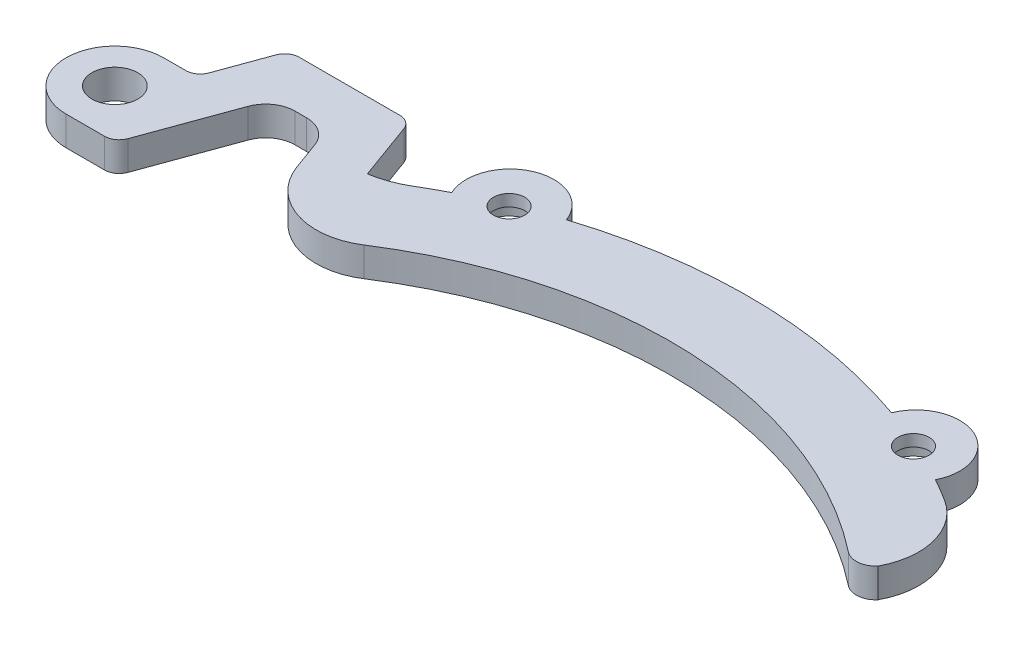
ISO-10303-21;
HEADER;
FILE_DESCRIPTION(('STEP AP214'),'2;1');
FILE_NAME('part.step','',(''),(''),'','','');
FILE_SCHEMA(('AUTOMOTIVE_DESIGN { 1 0 10303 214 1 1 1 1 }'));
ENDSEC;
DATA;
#1=APPLICATION_CONTEXT('core data for automotive mechanical design processes');
#2=APPLICATION_PROTOCOL_DEFINITION('international standard','automotive_design',2000,#1);
#3=PRODUCT_CONTEXT('',#1,'mechanical');
#4=PRODUCT('Part','Part','',(#3));
#5=PRODUCT_RELATED_PRODUCT_CATEGORY('part','',(#4));
#6=PRODUCT_DEFINITION_FORMATION('','',#4);
#7=PRODUCT_DEFINITION_CONTEXT('part definition',#1,'design');
#8=PRODUCT_DEFINITION('design','',#6,#7);
#9=PRODUCT_DEFINITION_SHAPE('','',#8);
#10=(LENGTH_UNIT() NAMED_UNIT(*) SI_UNIT(.MILLI.,.METRE.));
#11=(NAMED_UNIT(*) PLANE_ANGLE_UNIT() SI_UNIT($,.RADIAN.));
#12=(NAMED_UNIT(*) SI_UNIT($,.STERADIAN.) SOLID_ANGLE_UNIT());
#13=UNCERTAINTY_MEASURE_WITH_UNIT(LENGTH_MEASURE(1.E-05),#10,'distance_accuracy_value','');
#14=(GEOMETRIC_REPRESENTATION_CONTEXT(3) GLOBAL_UNCERTAINTY_ASSIGNED_CONTEXT((#13)) GLOBAL_UNIT_ASSIGNED_CONTEXT((#10,
#11,#12)) REPRESENTATION_CONTEXT('',''));
#15=CARTESIAN_POINT('',(0.,0.,0.));
#16=DIRECTION('',(0.,0.,1.));
#17=DIRECTION('',(1.,0.,0.));
#18=AXIS2_PLACEMENT_3D('',#15,#16,#17);
#19=CARTESIAN_POINT('',(-18.1544486033679,-8.49803041918904,6.6076789111415));
#20=DIRECTION('',(-0.939692620785909,0.,0.342020143325667));
#21=DIRECTION('',(0.342020143325667,0.,0.939692620785909));
#22=AXIS2_PLACEMENT_3D('',#19,#20,#21);
#23=PLANE('',#22);
#24=DIRECTION('',(0.342020143325667,0.,0.939692620785909));
#25=VECTOR('',#24,1.);
#26=CARTESIAN_POINT('',(-18.1544486033679,-8.49803041918904,6.6076789111415));
#27=LINE('',#26,#25);
#28=CARTESIAN_POINT('',(-17.0906558751119,-8.49803041918904,9.53042541100485));
#29=VERTEX_POINT('',#28);
#30=CARTESIAN_POINT('',(-14.9509114216332,-8.49803041918904,15.4093249803407));
#31=VERTEX_POINT('',#30);
#32=EDGE_CURVE('E209',#29,#31,#27,.T.);
#33=ORIENTED_EDGE('',*,*,#32,.F.);
#34=DIRECTION('',(0.,1.,0.));
#35=VECTOR('',#34,1.);
#36=CARTESIAN_POINT('',(-17.0906558751119,-8.49803041918904,9.53042541100485));
#37=LINE('',#36,#35);
#38=CARTESIAN_POINT('',(-17.0906558751119,-5.49803041918904,9.53042541100485));
#39=VERTEX_POINT('',#38);
#40=EDGE_CURVE('E259',#29,#39,#37,.T.);
#41=ORIENTED_EDGE('',*,*,#40,.T.);
#42=DIRECTION('',(0.342020143325667,0.,0.939692620785909));
#43=VECTOR('',#42,1.);
#44=CARTESIAN_POINT('',(-18.1544486033679,-5.49803041918904,6.6076789111415));
#45=LINE('',#44,#43);
#46=CARTESIAN_POINT('',(-14.9509114216332,-5.49803041918904,15.4093249803407));
#47=VERTEX_POINT('',#46);
#48=EDGE_CURVE('E236',#39,#47,#45,.T.);
#49=ORIENTED_EDGE('',*,*,#48,.T.);
#50=DIRECTION('',(0.,1.,0.));
#51=VECTOR('',#50,1.);
#52=CARTESIAN_POINT('',(-14.9509114216332,-8.49803041918904,15.4093249803407));
#53=LINE('',#52,#51);
#54=EDGE_CURVE('E228',#31,#47,#53,.T.);
#55=ORIENTED_EDGE('',*,*,#54,.F.);
#56=EDGE_LOOP('',(#33,#41,#49,#55));
#57=FACE_BOUND('',#56,.T.);
#58=ADVANCED_FACE('F43',(#57),#23,.F.);
#59=CARTESIAN_POINT('',(-16.5832783788304,-8.49803041918904,5.54345562599335));
#60=DIRECTION('',(0.,1.,0.));
#61=DIRECTION('',(0.,0.,1.));
#62=AXIS2_PLACEMENT_3D('',#59,#60,#61);
#63=CYLINDRICAL_SURFACE('',#62,10.);
#64=CARTESIAN_POINT('',(-16.5832783788304,-5.49803041918904,5.54345562599335));
#65=DIRECTION('',(0.,-1.,0.));
#66=DIRECTION('',(0.,0.,-1.));
#67=AXIS2_PLACEMENT_3D('',#64,#65,#66);
#68=CIRCLE('',#67,10.);
#69=CARTESIAN_POINT('',(-11.4856920139622,-5.49803041918904,14.146630229168));
#70=VERTEX_POINT('',#69);
#71=EDGE_CURVE('E381',#47,#70,#68,.F.);
#72=ORIENTED_EDGE('',*,*,#71,.T.);
#73=DIRECTION('',(0.,1.,0.));
#74=VECTOR('',#73,1.);
#75=CARTESIAN_POINT('',(-11.4856920139622,-8.49803041918904,14.146630229168));
#76=LINE('',#75,#74);
#77=CARTESIAN_POINT('',(-11.4856920139622,-8.49803041918904,14.146630229168));
#78=VERTEX_POINT('',#77);
#79=EDGE_CURVE('E230',#78,#70,#76,.T.);
#80=ORIENTED_EDGE('',*,*,#79,.F.);
#81=CARTESIAN_POINT('',(-16.5832783788304,-8.49803041918904,5.54345562599335));
#82=DIRECTION('',(0.,-1.,0.));
#83=DIRECTION('',(0.,0.,-1.));
#84=AXIS2_PLACEMENT_3D('',#81,#82,#83);
#85=CIRCLE('',#84,10.);
#86=EDGE_CURVE('E214',#31,#78,#85,.F.);
#87=ORIENTED_EDGE('',*,*,#86,.F.);
#88=ORIENTED_EDGE('',*,*,#54,.T.);
#89=EDGE_LOOP('',(#72,#80,#87,#88));
#90=FACE_BOUND('',#89,.T.);
#91=ADVANCED_FACE('F227',(#90),#63,.F.);
#92=CARTESIAN_POINT('',(15.5315157198393,-8.49803041918904,59.7434556259938));
#93=DIRECTION('',(0.,1.,0.));
#94=DIRECTION('',(0.,0.,1.));
#95=AXIS2_PLACEMENT_3D('',#92,#93,#94);
#96=CYLINDRICAL_SURFACE('',#95,53.);
#97=CARTESIAN_POINT('',(15.5315157198393,-5.49803041918904,59.7434556259938));
#98=DIRECTION('',(0.,-1.,0.));
#99=DIRECTION('',(0.,0.,-1.));
#100=AXIS2_PLACEMENT_3D('',#97,#98,#99);
#101=CIRCLE('',#100,53.);
#102=CARTESIAN_POINT('',(-8.96711599722418,-5.49803041918904,12.7454020068099));
#103=VERTEX_POINT('',#102);
#104=EDGE_CURVE('E385',#70,#103,#101,.T.);
#105=ORIENTED_EDGE('',*,*,#104,.T.);
#106=DIRECTION('',(0.,1.,0.));
#107=VECTOR('',#106,1.);
#108=CARTESIAN_POINT('',(-8.96711599722418,-8.49803041918904,12.7454020068099));
#109=LINE('',#108,#107);
#110=CARTESIAN_POINT('',(-8.96711599722418,-8.49803041918904,12.7454020068099));
#111=VERTEX_POINT('',#110);
#112=EDGE_CURVE('E246',#111,#103,#109,.T.);
#113=ORIENTED_EDGE('',*,*,#112,.F.);
#114=CARTESIAN_POINT('',(15.5315157198393,-8.49803041918904,59.7434556259938));
#115=DIRECTION('',(0.,-1.,0.));
#116=DIRECTION('',(0.,0.,-1.));
#117=AXIS2_PLACEMENT_3D('',#114,#115,#116);
#118=CIRCLE('',#117,53.);
#119=EDGE_CURVE('E233',#78,#111,#118,.T.);
#120=ORIENTED_EDGE('',*,*,#119,.F.);
#121=ORIENTED_EDGE('',*,*,#79,.T.);
#122=EDGE_LOOP('',(#105,#113,#120,#121));
#123=FACE_BOUND('',#122,.T.);
#124=ADVANCED_FACE('F551',(#123),#96,.T.);
#125=CARTESIAN_POINT('',(-4.89200771055495,-8.49803041918904,10.8366085523157));
#126=DIRECTION('',(0.,1.,0.));
#127=DIRECTION('',(0.,0.,1.));
#128=AXIS2_PLACEMENT_3D('',#125,#126,#127);
#129=CYLINDRICAL_SURFACE('',#128,4.5);
#130=CARTESIAN_POINT('',(-4.89200771055495,-5.49803041918904,10.8366085523157));
#131=DIRECTION('',(0.,-1.,0.));
#132=DIRECTION('',(0.,0.,-1.));
#133=AXIS2_PLACEMENT_3D('',#130,#131,#132);
#134=CIRCLE('',#133,4.5);
#135=CARTESIAN_POINT('',(-0.669666832406358,-5.49803041918904,9.28038314810351));
#136=VERTEX_POINT('',#135);
#137=EDGE_CURVE('E388',#103,#136,#134,.T.);
#138=ORIENTED_EDGE('',*,*,#137,.T.);
#139=DIRECTION('',(0.,1.,0.));
#140=VECTOR('',#139,1.);
#141=CARTESIAN_POINT('',(-0.669666832406358,-8.49803041918904,9.28038314810351));
#142=LINE('',#141,#140);
#143=CARTESIAN_POINT('',(-0.669666832406358,-8.49803041918904,9.28038314810351));
#144=VERTEX_POINT('',#143);
#145=EDGE_CURVE('E462',#144,#136,#142,.T.);
#146=ORIENTED_EDGE('',*,*,#145,.F.);
#147=CARTESIAN_POINT('',(-4.89200771055495,-8.49803041918904,10.8366085523157));
#148=DIRECTION('',(0.,-1.,0.));
#149=DIRECTION('',(0.,0.,-1.));
#150=AXIS2_PLACEMENT_3D('',#147,#148,#149);
#151=CIRCLE('',#150,4.5);
#152=EDGE_CURVE('E473',#111,#144,#151,.T.);
#153=ORIENTED_EDGE('',*,*,#152,.F.);
#154=ORIENTED_EDGE('',*,*,#112,.T.);
#155=EDGE_LOOP('',(#138,#146,#153,#154));
#156=FACE_BOUND('',#155,.T.);
#157=ADVANCED_FACE('F471',(#156),#129,.T.);
#158=CARTESIAN_POINT('',(15.5315157198393,-8.49803041918904,59.7434556259938));
#159=DIRECTION('',(0.,1.,0.));
#160=DIRECTION('',(0.,0.,1.));
#161=AXIS2_PLACEMENT_3D('',#158,#159,#160);
#162=CYLINDRICAL_SURFACE('',#161,53.);
#163=CARTESIAN_POINT('',(15.5315157198393,-5.49803041918904,59.7434556259938));
#164=DIRECTION('',(0.,-1.,0.));
#165=DIRECTION('',(0.,0.,-1.));
#166=AXIS2_PLACEMENT_3D('',#163,#164,#165);
#167=CIRCLE('',#166,53.);
#168=CARTESIAN_POINT('',(33.1353607437697,-5.49803041918904,9.75241002407189));
#169=VERTEX_POINT('',#168);
#170=EDGE_CURVE('E391',#136,#169,#167,.T.);
#171=ORIENTED_EDGE('',*,*,#170,.T.);
#172=DIRECTION('',(0.,1.,0.));
#173=VECTOR('',#172,1.);
#174=CARTESIAN_POINT('',(33.1353607437697,-8.49803041918904,9.75241002407189));
#175=LINE('',#174,#173);
#176=CARTESIAN_POINT('',(33.1353607437697,-8.49803041918904,9.75241002407189));
#177=VERTEX_POINT('',#176);
#178=EDGE_CURVE('E458',#177,#169,#175,.T.);
#179=ORIENTED_EDGE('',*,*,#178,.F.);
#180=CARTESIAN_POINT('',(15.5315157198393,-8.49803041918904,59.7434556259938));
#181=DIRECTION('',(0.,-1.,0.));
#182=DIRECTION('',(0.,0.,-1.));
#183=AXIS2_PLACEMENT_3D('',#180,#181,#182);
#184=CIRCLE('',#183,53.);
#185=EDGE_CURVE('E491',#144,#177,#184,.T.);
#186=ORIENTED_EDGE('',*,*,#185,.F.);
#187=ORIENTED_EDGE('',*,*,#145,.T.);
#188=EDGE_LOOP('',(#171,#179,#186,#187));
#189=FACE_BOUND('',#188,.T.);
#190=ADVANCED_FACE('F481',(#189),#162,.T.);
#191=CARTESIAN_POINT('',(37.3126041228506,-8.49803041918904,11.4259206311267));
#192=DIRECTION('',(0.,1.,0.));
#193=DIRECTION('',(0.,0.,1.));
#194=AXIS2_PLACEMENT_3D('',#191,#192,#193);
#195=CYLINDRICAL_SURFACE('',#194,4.5);
#196=CARTESIAN_POINT('',(37.3126041228506,-5.49803041918904,11.4259206311267));
#197=DIRECTION('',(0.,-1.,0.));
#198=DIRECTION('',(0.,0.,-1.));
#199=AXIS2_PLACEMENT_3D('',#196,#197,#198);
#200=CIRCLE('',#199,4.5);
#201=CARTESIAN_POINT('',(41.3328282637111,-5.49803041918904,13.4477509546807));
#202=VERTEX_POINT('',#201);
#203=EDGE_CURVE('E394',#169,#202,#200,.T.);
#204=ORIENTED_EDGE('',*,*,#203,.T.);
#205=DIRECTION('',(0.,1.,0.));
#206=VECTOR('',#205,1.);
#207=CARTESIAN_POINT('',(41.3328282637111,-8.49803041918904,13.4477509546807));
#208=LINE('',#207,#206);
#209=CARTESIAN_POINT('',(41.3328282637111,-8.49803041918904,13.4477509546807));
#210=VERTEX_POINT('',#209);
#211=EDGE_CURVE('E454',#210,#202,#208,.T.);
#212=ORIENTED_EDGE('',*,*,#211,.F.);
#213=CARTESIAN_POINT('',(37.3126041228506,-8.49803041918904,11.4259206311267));
#214=DIRECTION('',(0.,-1.,0.));
#215=DIRECTION('',(0.,0.,-1.));
#216=AXIS2_PLACEMENT_3D('',#213,#214,#215);
#217=CIRCLE('',#216,4.5);
#218=EDGE_CURVE('E487',#177,#210,#217,.T.);
#219=ORIENTED_EDGE('',*,*,#218,.F.);
#220=ORIENTED_EDGE('',*,*,#178,.T.);
#221=EDGE_LOOP('',(#204,#212,#219,#220));
#222=FACE_BOUND('',#221,.T.);
#223=ADVANCED_FACE('F485',(#222),#195,.T.);
#224=CARTESIAN_POINT('',(15.5315157198393,-8.49803041918904,59.7434556259938));
#225=DIRECTION('',(0.,1.,0.));
#226=DIRECTION('',(0.,0.,1.));
#227=AXIS2_PLACEMENT_3D('',#224,#225,#226);
#228=CYLINDRICAL_SURFACE('',#227,53.);
#229=CARTESIAN_POINT('',(15.5315157198393,-5.49803041918904,59.7434556259938));
#230=DIRECTION('',(0.,-1.,0.));
#231=DIRECTION('',(0.,0.,-1.));
#232=AXIS2_PLACEMENT_3D('',#229,#230,#231);
#233=CIRCLE('',#232,53.);
#234=CARTESIAN_POINT('',(43.6010548096564,-5.49803041918904,14.7867989966889));
#235=VERTEX_POINT('',#234);
#236=EDGE_CURVE('E397',#202,#235,#233,.T.);
#237=ORIENTED_EDGE('',*,*,#236,.T.);
#238=DIRECTION('',(0.,1.,0.));
#239=VECTOR('',#238,1.);
#240=CARTESIAN_POINT('',(43.6010548096564,-8.49803041918904,14.7867989966889));
#241=LINE('',#240,#239);
#242=CARTESIAN_POINT('',(43.6010548096564,-8.49803041918904,14.7867989966889));
#243=VERTEX_POINT('',#242);
#244=EDGE_CURVE('E450',#243,#235,#241,.T.);
#245=ORIENTED_EDGE('',*,*,#244,.F.);
#246=CARTESIAN_POINT('',(15.5315157198393,-8.49803041918904,59.7434556259938));
#247=DIRECTION('',(0.,-1.,0.));
#248=DIRECTION('',(0.,0.,-1.));
#249=AXIS2_PLACEMENT_3D('',#246,#247,#248);
#250=CIRCLE('',#249,53.);
#251=EDGE_CURVE('E490',#210,#243,#250,.T.);
#252=ORIENTED_EDGE('',*,*,#251,.F.);
#253=ORIENTED_EDGE('',*,*,#211,.T.);
#254=EDGE_LOOP('',(#237,#245,#252,#253));
#255=FACE_BOUND('',#254,.T.);
#256=ADVANCED_FACE('F537',(#255),#228,.T.);
#257=CARTESIAN_POINT('',(39.8937571940201,-8.49803041918904,20.7244706269744));
#258=DIRECTION('',(0.,1.,0.));
#259=DIRECTION('',(0.,0.,1.));
#260=AXIS2_PLACEMENT_3D('',#257,#258,#259);
#261=CYLINDRICAL_SURFACE('',#260,7.);
#262=CARTESIAN_POINT('',(39.8937571940201,-5.49803041918904,20.7244706269744));
#263=DIRECTION('',(0.,-1.,0.));
#264=DIRECTION('',(0.,0.,-1.));
#265=AXIS2_PLACEMENT_3D('',#262,#263,#264);
#266=CIRCLE('',#265,7.);
#267=CARTESIAN_POINT('',(46.0502312891413,-5.49803041918904,24.0558107050965));
#268=VERTEX_POINT('',#267);
#269=EDGE_CURVE('E400',#235,#268,#266,.T.);
#270=ORIENTED_EDGE('',*,*,#269,.T.);
#271=DIRECTION('',(0.,1.,0.));
#272=VECTOR('',#271,1.);
#273=CARTESIAN_POINT('',(46.0502312891413,-8.49803041918904,24.0558107050965));
#274=LINE('',#273,#272);
#275=CARTESIAN_POINT('',(46.0502312891413,-8.49803041918904,24.0558107050965));
#276=VERTEX_POINT('',#275);
#277=EDGE_CURVE('E446',#276,#268,#274,.T.);
#278=ORIENTED_EDGE('',*,*,#277,.F.);
#279=CARTESIAN_POINT('',(39.8937571940201,-8.49803041918904,20.7244706269744));
#280=DIRECTION('',(0.,-1.,0.));
#281=DIRECTION('',(0.,0.,-1.));
#282=AXIS2_PLACEMENT_3D('',#279,#280,#281);
#283=CIRCLE('',#282,7.);
#284=EDGE_CURVE('E495',#243,#276,#283,.T.);
#285=ORIENTED_EDGE('',*,*,#284,.F.);
#286=ORIENTED_EDGE('',*,*,#244,.T.);
#287=EDGE_LOOP('',(#270,#278,#285,#286));
#288=FACE_BOUND('',#287,.T.);
#289=ADVANCED_FACE('F533',(#288),#261,.T.);
#290=CARTESIAN_POINT('',(44.5302312891412,-8.49803041918904,22.7559645603548));
#291=DIRECTION('',(0.,1.,0.));
#292=DIRECTION('',(0.,0.,1.));
#293=AXIS2_PLACEMENT_3D('',#290,#291,#292);
#294=CYLINDRICAL_SURFACE('',#293,2.);
#295=CARTESIAN_POINT('',(44.5302312891412,-5.49803041918904,22.7559645603548));
#296=DIRECTION('',(0.,-1.,0.));
#297=DIRECTION('',(0.,0.,-1.));
#298=AXIS2_PLACEMENT_3D('',#295,#296,#297);
#299=CIRCLE('',#298,2.);
#300=CARTESIAN_POINT('',(43.2962433925752,-5.49803041918904,24.3299003503821));
#301=VERTEX_POINT('',#300);
#302=EDGE_CURVE('E403',#268,#301,#299,.T.);
#303=ORIENTED_EDGE('',*,*,#302,.T.);
#304=DIRECTION('',(0.,1.,0.));
#305=VECTOR('',#304,1.);
#306=CARTESIAN_POINT('',(43.2962433925752,-8.49803041918904,24.3299003503821));
#307=LINE('',#306,#305);
#308=CARTESIAN_POINT('',(43.2962433925752,-8.49803041918904,24.3299003503821));
#309=VERTEX_POINT('',#308);
#310=EDGE_CURVE('E442',#309,#301,#307,.T.);
#311=ORIENTED_EDGE('',*,*,#310,.F.);
#312=CARTESIAN_POINT('',(44.5302312891412,-8.49803041918904,22.7559645603548));
#313=DIRECTION('',(0.,-1.,0.));
#314=DIRECTION('',(0.,0.,-1.));
#315=AXIS2_PLACEMENT_3D('',#312,#313,#314);
#316=CIRCLE('',#315,2.);
#317=EDGE_CURVE('E502',#276,#309,#316,.T.);
#318=ORIENTED_EDGE('',*,*,#317,.F.);
#319=ORIENTED_EDGE('',*,*,#277,.T.);
#320=EDGE_LOOP('',(#303,#311,#318,#319));
#321=FACE_BOUND('',#320,.T.);
#322=ADVANCED_FACE('F529',(#321),#294,.T.);
#323=CARTESIAN_POINT('',(15.5315157198393,-8.49803041918904,59.7434556259938));
#324=DIRECTION('',(0.,1.,0.));
#325=DIRECTION('',(0.,0.,1.));
#326=AXIS2_PLACEMENT_3D('',#323,#324,#325);
#327=CYLINDRICAL_SURFACE('',#326,45.);
#328=CARTESIAN_POINT('',(15.5315157198393,-5.49803041918904,59.7434556259938));
#329=DIRECTION('',(0.,-1.,0.));
#330=DIRECTION('',(0.,0.,-1.));
#331=AXIS2_PLACEMENT_3D('',#328,#329,#330);
#332=CIRCLE('',#331,45.);
#333=CARTESIAN_POINT('',(-8.81582737921854,-5.49803041918904,21.8989463278571));
#334=VERTEX_POINT('',#333);
#335=EDGE_CURVE('E406',#301,#334,#332,.F.);
#336=ORIENTED_EDGE('',*,*,#335,.T.);
#337=DIRECTION('',(0.,1.,0.));
#338=VECTOR('',#337,1.);
#339=CARTESIAN_POINT('',(-8.81582737921855,-8.49803041918904,21.898946327857));
#340=LINE('',#339,#338);
#341=CARTESIAN_POINT('',(-8.81582737921854,-8.49803041918904,21.8989463278571));
#342=VERTEX_POINT('',#341);
#343=EDGE_CURVE('E252',#334,#342,#340,.F.);
#344=ORIENTED_EDGE('',*,*,#343,.T.);
#345=CARTESIAN_POINT('',(15.5315157198393,-8.49803041918904,59.7434556259938));
#346=DIRECTION('',(0.,-1.,0.));
#347=DIRECTION('',(0.,0.,-1.));
#348=AXIS2_PLACEMENT_3D('',#345,#346,#347);
#349=CIRCLE('',#348,45.);
#350=EDGE_CURVE('E505',#309,#342,#349,.F.);
#351=ORIENTED_EDGE('',*,*,#350,.F.);
#352=ORIENTED_EDGE('',*,*,#310,.T.);
#353=EDGE_LOOP('',(#336,#344,#351,#352));
#354=FACE_BOUND('',#353,.T.);
#355=ADVANCED_FACE('F525',(#354),#327,.F.);
#356=CARTESIAN_POINT('',(-22.8529117072974,-8.49803041918904,8.3177796277699));
#357=DIRECTION('',(-0.939692620785908,0.,0.342020143325669));
#358=DIRECTION('',(0.342020143325669,0.,0.939692620785908));
#359=AXIS2_PLACEMENT_3D('',#356,#357,#358);
#360=PLANE('',#359);
#361=DIRECTION('',(0.34202014332567,0.,0.939692620785908));
#362=VECTOR('',#361,1.);
#363=CARTESIAN_POINT('',(-22.8529117072974,-5.49803041918904,8.3177796277699));
#364=LINE('',#363,#362);
#365=CARTESIAN_POINT('',(-20.2324659422962,-5.49803041918904,15.5173951960163));
#366=VERTEX_POINT('',#365);
#367=CARTESIAN_POINT('',(-19.1810402067956,-5.49803041918904,18.4061636625377));
#368=VERTEX_POINT('',#367);
#369=EDGE_CURVE('E342',#366,#368,#364,.T.);
#370=ORIENTED_EDGE('',*,*,#369,.F.);
#371=DIRECTION('',(0.,1.,0.));
#372=VECTOR('',#371,1.);
#373=CARTESIAN_POINT('',(-20.2324659422962,-8.49803041918904,15.5173951960163));
#374=LINE('',#373,#372);
#375=CARTESIAN_POINT('',(-20.2324659422962,-8.49803041918904,15.5173951960163));
#376=VERTEX_POINT('',#375);
#377=EDGE_CURVE('E316',#366,#376,#374,.F.);
#378=ORIENTED_EDGE('',*,*,#377,.T.);
#379=DIRECTION('',(0.34202014332567,0.,0.939692620785908));
#380=VECTOR('',#379,1.);
#381=CARTESIAN_POINT('',(-22.8529117072974,-8.49803041918904,8.3177796277699));
#382=LINE('',#381,#380);
#383=CARTESIAN_POINT('',(-19.1810402067956,-8.49803041918904,18.4061636625377));
#384=VERTEX_POINT('',#383);
#385=EDGE_CURVE('E357',#376,#384,#382,.T.);
#386=ORIENTED_EDGE('',*,*,#385,.T.);
#387=DIRECTION('',(0.,-1.,0.));
#388=VECTOR('',#387,1.);
#389=CARTESIAN_POINT('',(-19.1810402067956,-8.49803041918904,18.4061636625377));
#390=LINE('',#389,#388);
#391=EDGE_CURVE('E239',#384,#368,#390,.F.);
#392=ORIENTED_EDGE('',*,*,#391,.T.);
#393=EDGE_LOOP('',(#370,#378,#386,#392));
#394=FACE_BOUND('',#393,.T.);
#395=ADVANCED_FACE('F512',(#394),#360,.T.);
#396=CARTESIAN_POINT('',(0.,-8.49803041918904,13.5434556259934));
#397=DIRECTION('',(0.,0.,1.));
#398=DIRECTION('',(1.,0.,0.));
#399=AXIS2_PLACEMENT_3D('',#396,#397,#398);
#400=PLANE('',#399);
#401=DIRECTION('',(1.,0.,0.));
#402=VECTOR('',#401,1.);
#403=CARTESIAN_POINT('',(0.,-8.49803041918904,13.5434556259934));
#404=LINE('',#403,#402);
#405=CARTESIAN_POINT('',(-24.2467571110259,-8.49803041918904,13.5434556259933));
#406=VERTEX_POINT('',#405);
#407=CARTESIAN_POINT('',(-23.0515438046539,-8.49803041918904,13.5434556259933));
#408=VERTEX_POINT('',#407);
#409=EDGE_CURVE('E351',#406,#408,#404,.T.);
#410=ORIENTED_EDGE('',*,*,#409,.T.);
#411=DIRECTION('',(0.,1.,0.));
#412=VECTOR('',#411,1.);
#413=CARTESIAN_POINT('',(-23.0515438046539,-5.49803041918904,13.5434556259933));
#414=LINE('',#413,#412);
#415=CARTESIAN_POINT('',(-23.0515438046539,-5.49803041918904,13.5434556259933));
#416=VERTEX_POINT('',#415);
#417=EDGE_CURVE('E312',#408,#416,#414,.T.);
#418=ORIENTED_EDGE('',*,*,#417,.T.);
#419=DIRECTION('',(1.,0.,0.));
#420=VECTOR('',#419,1.);
#421=CARTESIAN_POINT('',(0.,-5.49803041918904,13.5434556259934));
#422=LINE('',#421,#420);
#423=CARTESIAN_POINT('',(-24.2467571110259,-5.49803041918904,13.5434556259933));
#424=VERTEX_POINT('',#423);
#425=EDGE_CURVE('E334',#424,#416,#422,.T.);
#426=ORIENTED_EDGE('',*,*,#425,.F.);
#427=DIRECTION('',(0.,1.,0.));
#428=VECTOR('',#427,1.);
#429=CARTESIAN_POINT('',(-24.2467571110259,-8.49803041918904,13.5434556259933));
#430=LINE('',#429,#428);
#431=EDGE_CURVE('E309',#424,#406,#430,.F.);
#432=ORIENTED_EDGE('',*,*,#431,.T.);
#433=EDGE_LOOP('',(#410,#418,#426,#432));
#434=FACE_BOUND('',#433,.T.);
#435=ADVANCED_FACE('F339',(#434),#400,.T.);
#436=CARTESIAN_POINT('',(-18.9125390432552,-8.49803041918904,-6.88360126614239));
#437=DIRECTION('',(0.939692620785907,0.,0.342020143325673));
#438=DIRECTION('',(0.342020143325673,0.,-0.939692620785907));
#439=AXIS2_PLACEMENT_3D('',#436,#437,#438);
#440=PLANE('',#439);
#441=DIRECTION('',(0.342020143325673,0.,-0.939692620785907));
#442=VECTOR('',#441,1.);
#443=CARTESIAN_POINT('',(-18.9125390432552,-8.49803041918904,-6.88360126614239));
#444=LINE('',#443,#442);
#445=CARTESIAN_POINT('',(-30.3557949129851,-8.49803041918904,24.5564858409817));
#446=VERTEX_POINT('',#445);
#447=CARTESIAN_POINT('',(-27.0658349733836,-8.49803041918904,15.5173951960163));
#448=VERTEX_POINT('',#447);
#449=EDGE_CURVE('E347',#446,#448,#444,.T.);
#450=ORIENTED_EDGE('',*,*,#449,.T.);
#451=DIRECTION('',(0.,1.,0.));
#452=VECTOR('',#451,1.);
#453=CARTESIAN_POINT('',(-27.0658349733836,-5.49803041918904,15.5173951960163));
#454=LINE('',#453,#452);
#455=CARTESIAN_POINT('',(-27.0658349733836,-5.49803041918904,15.5173951960163));
#456=VERTEX_POINT('',#455);
#457=EDGE_CURVE('E319',#448,#456,#454,.T.);
#458=ORIENTED_EDGE('',*,*,#457,.T.);
#459=DIRECTION('',(0.342020143325673,0.,-0.939692620785907));
#460=VECTOR('',#459,1.);
#461=CARTESIAN_POINT('',(-18.9125390432552,-5.49803041918904,-6.88360126614239));
#462=LINE('',#461,#460);
#463=CARTESIAN_POINT('',(-30.3557949129851,-5.49803041918904,24.5564858409817));
#464=VERTEX_POINT('',#463);
#465=EDGE_CURVE('E336',#464,#456,#462,.T.);
#466=ORIENTED_EDGE('',*,*,#465,.F.);
#467=DIRECTION('',(0.,1.,0.));
#468=VECTOR('',#467,1.);
#469=CARTESIAN_POINT('',(-30.3557949129851,-8.49803041918904,24.5564858409817));
#470=LINE('',#469,#468);
#471=EDGE_CURVE('E300',#464,#446,#470,.F.);
#472=ORIENTED_EDGE('',*,*,#471,.T.);
#473=EDGE_LOOP('',(#450,#458,#466,#472));
#474=FACE_BOUND('',#473,.T.);
#475=ADVANCED_FACE('F345',(#474),#440,.T.);
#476=CARTESIAN_POINT('',(0.,-8.49803041918904,25.5434556259932));
#477=DIRECTION('',(0.,0.,-1.));
#478=DIRECTION('',(-1.,0.,0.));
#479=AXIS2_PLACEMENT_3D('',#476,#477,#478);
#480=PLANE('',#479);
#481=DIRECTION('',(-1.,0.,0.));
#482=VECTOR('',#481,1.);
#483=CARTESIAN_POINT('',(0.,-8.49803041918904,25.5434556259932));
#484=LINE('',#483,#482);
#485=CARTESIAN_POINT('',(-31.765333844164,-8.49803041918904,25.5434556259932));
#486=VERTEX_POINT('',#485);
#487=CARTESIAN_POINT('',(-35.7150225368494,-8.49803041918904,25.5434556259931));
#488=VERTEX_POINT('',#487);
#489=EDGE_CURVE('E350',#486,#488,#484,.T.);
#490=ORIENTED_EDGE('',*,*,#489,.F.);
#491=DIRECTION('',(0.,1.,0.));
#492=VECTOR('',#491,1.);
#493=CARTESIAN_POINT('',(-31.765333844164,-5.49803041918904,25.5434556259932));
#494=LINE('',#493,#492);
#495=CARTESIAN_POINT('',(-31.765333844164,-5.49803041918904,25.5434556259932));
#496=VERTEX_POINT('',#495);
#497=EDGE_CURVE('E296',#486,#496,#494,.T.);
#498=ORIENTED_EDGE('',*,*,#497,.T.);
#499=DIRECTION('',(-1.,0.,0.));
#500=VECTOR('',#499,1.);
#501=CARTESIAN_POINT('',(0.,-5.49803041918904,25.5434556259932));
#502=LINE('',#501,#500);
#503=CARTESIAN_POINT('',(-35.7150225368494,-5.49803041918904,25.5434556259931));
#504=VERTEX_POINT('',#503);
#505=EDGE_CURVE('E414',#496,#504,#502,.T.);
#506=ORIENTED_EDGE('',*,*,#505,.T.);
#507=DIRECTION('',(0.,1.,0.));
#508=VECTOR('',#507,1.);
#509=CARTESIAN_POINT('',(-35.7150225368494,-8.49803041918904,25.5434556259931));
#510=LINE('',#509,#508);
#511=EDGE_CURVE('E438',#488,#504,#510,.T.);
#512=ORIENTED_EDGE('',*,*,#511,.F.);
#513=EDGE_LOOP('',(#490,#498,#506,#512));
#514=FACE_BOUND('',#513,.T.);
#515=ADVANCED_FACE('F620',(#514),#480,.F.);
#516=CARTESIAN_POINT('',(-35.7150225368494,-8.49803041918904,20.5434556259932));
#517=DIRECTION('',(0.,1.,0.));
#518=DIRECTION('',(0.,0.,1.));
#519=AXIS2_PLACEMENT_3D('',#516,#517,#518);
#520=CYLINDRICAL_SURFACE('',#519,4.99999999999993);
#521=CARTESIAN_POINT('',(-35.7150225368494,-5.49803041918904,20.5434556259932));
#522=DIRECTION('',(0.,-1.,0.));
#523=DIRECTION('',(0.,0.,-1.));
#524=AXIS2_PLACEMENT_3D('',#521,#522,#523);
#525=CIRCLE('',#524,4.99999999999993);
#526=CARTESIAN_POINT('',(-35.7150225368494,-5.49803041918904,15.5434556259933));
#527=VERTEX_POINT('',#526);
#528=EDGE_CURVE('E417',#504,#527,#525,.T.);
#529=ORIENTED_EDGE('',*,*,#528,.T.);
#530=DIRECTION('',(0.,1.,0.));
#531=VECTOR('',#530,1.);
#532=CARTESIAN_POINT('',(-35.7150225368494,-8.49803041918904,15.5434556259933));
#533=LINE('',#532,#531);
#534=CARTESIAN_POINT('',(-35.7150225368494,-8.49803041918904,15.5434556259933));
#535=VERTEX_POINT('',#534);
#536=EDGE_CURVE('E378',#535,#527,#533,.T.);
#537=ORIENTED_EDGE('',*,*,#536,.F.);
#538=CARTESIAN_POINT('',(-35.7150225368494,-8.49803041918904,20.5434556259932));
#539=DIRECTION('',(0.,-1.,0.));
#540=DIRECTION('',(0.,0.,-1.));
#541=AXIS2_PLACEMENT_3D('',#538,#539,#540);
#542=CIRCLE('',#541,4.99999999999993);
#543=EDGE_CURVE('E355',#488,#535,#542,.T.);
#544=ORIENTED_EDGE('',*,*,#543,.F.);
#545=ORIENTED_EDGE('',*,*,#511,.T.);
#546=EDGE_LOOP('',(#529,#537,#544,#545));
#547=FACE_BOUND('',#546,.T.);
#548=ADVANCED_FACE('F616',(#547),#520,.T.);
#549=CARTESIAN_POINT('',(0.,-8.49803041918904,15.5434556259934));
#550=DIRECTION('',(0.,0.,1.));
#551=DIRECTION('',(1.,0.,0.));
#552=AXIS2_PLACEMENT_3D('',#549,#550,#551);
#553=PLANE('',#552);
#554=DIRECTION('',(1.,0.,0.));
#555=VECTOR('',#554,1.);
#556=CARTESIAN_POINT('',(0.,-5.49803041918904,15.5434556259934));
#557=LINE('',#556,#555);
#558=CARTESIAN_POINT('',(-33.4465203638815,-5.49803041918904,15.5434556259933));
#559=VERTEX_POINT('',#558);
#560=EDGE_CURVE('E420',#527,#559,#557,.T.);
#561=ORIENTED_EDGE('',*,*,#560,.T.);
#562=DIRECTION('',(0.,1.,0.));
#563=VECTOR('',#562,1.);
#564=CARTESIAN_POINT('',(-33.4465203638815,-8.49803041918904,15.5434556259933));
#565=LINE('',#564,#563);
#566=CARTESIAN_POINT('',(-33.4465203638815,-8.49803041918904,15.5434556259933));
#567=VERTEX_POINT('',#566);
#568=EDGE_CURVE('E293',#559,#567,#565,.F.);
#569=ORIENTED_EDGE('',*,*,#568,.T.);
#570=DIRECTION('',(1.,0.,0.));
#571=VECTOR('',#570,1.);
#572=CARTESIAN_POINT('',(0.,-8.49803041918904,15.5434556259934));
#573=LINE('',#572,#571);
#574=EDGE_CURVE('E363',#535,#567,#573,.T.);
#575=ORIENTED_EDGE('',*,*,#574,.F.);
#576=ORIENTED_EDGE('',*,*,#536,.T.);
#577=EDGE_LOOP('',(#561,#569,#575,#576));
#578=FACE_BOUND('',#577,.T.);
#579=ADVANCED_FACE('F612',(#578),#553,.F.);
#580=CARTESIAN_POINT('',(-23.6110021471847,-8.49803041918904,-8.59370198277076));
#581=DIRECTION('',(-0.939692620785907,0.,-0.342020143325673));
#582=DIRECTION('',(-0.342020143325673,0.,0.939692620785907));
#583=AXIS2_PLACEMENT_3D('',#580,#581,#582);
#584=PLANE('',#583);
#585=DIRECTION('',(-0.342020143325673,0.,0.939692620785907));
#586=VECTOR('',#585,1.);
#587=CARTESIAN_POINT('',(-23.6110021471847,-5.49803041918904,-8.59370198277076));
#588=LINE('',#587,#586);
#589=CARTESIAN_POINT('',(-30.2076450405678,-5.49803041918904,9.5304254110048));
#590=VERTEX_POINT('',#589);
#591=CARTESIAN_POINT('',(-32.0369814327027,-5.49803041918904,14.5564858409819));
#592=VERTEX_POINT('',#591);
#593=EDGE_CURVE('E424',#590,#592,#588,.T.);
#594=ORIENTED_EDGE('',*,*,#593,.F.);
#595=DIRECTION('',(0.,1.,0.));
#596=VECTOR('',#595,1.);
#597=CARTESIAN_POINT('',(-30.2076450405678,-8.49803041918904,9.5304254110048));
#598=LINE('',#597,#596);
#599=CARTESIAN_POINT('',(-30.2076450405678,-8.49803041918904,9.5304254110048));
#600=VERTEX_POINT('',#599);
#601=EDGE_CURVE('E290',#590,#600,#598,.F.);
#602=ORIENTED_EDGE('',*,*,#601,.T.);
#603=DIRECTION('',(-0.342020143325673,0.,0.939692620785907));
#604=VECTOR('',#603,1.);
#605=CARTESIAN_POINT('',(-23.6110021471847,-8.49803041918904,-8.59370198277076));
#606=LINE('',#605,#604);
#607=CARTESIAN_POINT('',(-32.0369814327027,-8.49803041918904,14.5564858409819));
#608=VERTEX_POINT('',#607);
#609=EDGE_CURVE('E367',#600,#608,#606,.T.);
#610=ORIENTED_EDGE('',*,*,#609,.T.);
#611=DIRECTION('',(0.,1.,0.));
#612=VECTOR('',#611,1.);
#613=CARTESIAN_POINT('',(-32.0369814327027,-8.49803041918904,14.5564858409819));
#614=LINE('',#613,#612);
#615=EDGE_CURVE('E286',#608,#592,#614,.T.);
#616=ORIENTED_EDGE('',*,*,#615,.T.);
#617=EDGE_LOOP('',(#594,#602,#610,#616));
#618=FACE_BOUND('',#617,.T.);
#619=ADVANCED_FACE('F608',(#618),#584,.T.);
#620=CARTESIAN_POINT('',(0.,-8.49803041918904,8.54345562599342));
#621=DIRECTION('',(0.,0.,1.));
#622=DIRECTION('',(1.,0.,0.));
#623=AXIS2_PLACEMENT_3D('',#620,#621,#622);
#624=PLANE('',#623);
#625=DIRECTION('',(1.,0.,0.));
#626=VECTOR('',#625,1.);
#627=CARTESIAN_POINT('',(0.,-5.49803041918904,8.54345562599342));
#628=LINE('',#627,#626);
#629=CARTESIAN_POINT('',(-28.798106109389,-5.49803041918904,8.54345562599331));
#630=VERTEX_POINT('',#629);
#631=CARTESIAN_POINT('',(-18.5001948062908,-5.49803041918904,8.54345562599335));
#632=VERTEX_POINT('',#631);
#633=EDGE_CURVE('E428',#630,#632,#628,.T.);
#634=ORIENTED_EDGE('',*,*,#633,.T.);
#635=DIRECTION('',(0.,1.,0.));
#636=VECTOR('',#635,1.);
#637=CARTESIAN_POINT('',(-18.5001948062908,-8.49803041918904,8.54345562599335));
#638=LINE('',#637,#636);
#639=CARTESIAN_POINT('',(-18.5001948062908,-8.49803041918904,8.54345562599335));
#640=VERTEX_POINT('',#639);
#641=EDGE_CURVE('E275',#632,#640,#638,.F.);
#642=ORIENTED_EDGE('',*,*,#641,.T.);
#643=DIRECTION('',(1.,0.,0.));
#644=VECTOR('',#643,1.);
#645=CARTESIAN_POINT('',(0.,-8.49803041918904,8.54345562599342));
#646=LINE('',#645,#644);
#647=CARTESIAN_POINT('',(-28.798106109389,-8.49803041918904,8.54345562599331));
#648=VERTEX_POINT('',#647);
#649=EDGE_CURVE('E371',#648,#640,#646,.T.);
#650=ORIENTED_EDGE('',*,*,#649,.F.);
#651=DIRECTION('',(0.,1.,0.));
#652=VECTOR('',#651,1.);
#653=CARTESIAN_POINT('',(-28.798106109389,-5.49803041918904,8.54345562599331));
#654=LINE('',#653,#652);
#655=EDGE_CURVE('E271',#648,#630,#654,.T.);
#656=ORIENTED_EDGE('',*,*,#655,.T.);
#657=EDGE_LOOP('',(#634,#642,#650,#656));
#658=FACE_BOUND('',#657,.T.);
#659=ADVANCED_FACE('F604',(#658),#624,.F.);
#660=CARTESIAN_POINT('',(-35.7150225368494,-8.49803041918904,20.5434556259932));
#661=DIRECTION('',(0.,1.,0.));
#662=DIRECTION('',(0.,0.,1.));
#663=AXIS2_PLACEMENT_3D('',#660,#661,#662);
#664=CYLINDRICAL_SURFACE('',#663,2.35);
#665=CARTESIAN_POINT('',(-35.7150225368494,-8.49803041918904,20.5434556259932));
#666=DIRECTION('',(0.,-1.,0.));
#667=DIRECTION('',(0.,0.,-1.));
#668=AXIS2_PLACEMENT_3D('',#665,#666,#667);
#669=CIRCLE('',#668,2.35);
#670=CARTESIAN_POINT('',(-35.7150225368494,-8.49803041918904,18.1934556259932));
#671=VERTEX_POINT('',#670);
#672=EDGE_CURVE('E374',#671,#671,#669,.F.);
#673=ORIENTED_EDGE('',*,*,#672,.F.);
#674=EDGE_LOOP('',(#673));
#675=FACE_BOUND('',#674,.T.);
#676=CARTESIAN_POINT('',(-35.7150225368494,-5.49803041918904,20.5434556259932));
#677=DIRECTION('',(0.,-1.,0.));
#678=DIRECTION('',(0.,0.,-1.));
#679=AXIS2_PLACEMENT_3D('',#676,#677,#678);
#680=CIRCLE('',#679,2.35);
#681=CARTESIAN_POINT('',(-35.7150225368494,-5.49803041918904,18.1934556259932));
#682=VERTEX_POINT('',#681);
#683=EDGE_CURVE('E223',#682,#682,#680,.F.);
#684=ORIENTED_EDGE('',*,*,#683,.T.);
#685=EDGE_LOOP('',(#684));
#686=FACE_BOUND('',#685,.T.);
#687=ADVANCED_FACE('F597',(#675,#686),#664,.F.);
#688=CARTESIAN_POINT('',(0.,-8.49803041918904,0.));
#689=DIRECTION('',(0.,-1.,0.));
#690=DIRECTION('',(0.,0.,-1.));
#691=AXIS2_PLACEMENT_3D('',#688,#689,#690);
#692=PLANE('',#691);
#693=CARTESIAN_POINT('',(-4.81839141481527,-8.49803041918904,11.0128925774567));
#694=DIRECTION('',(0.,-1.,0.));
#695=DIRECTION('',(0.,0.,-1.));
#696=AXIS2_PLACEMENT_3D('',#693,#694,#695);
#697=CIRCLE('',#696,3.);
#698=CARTESIAN_POINT('',(-4.81839141481527,-8.49803041918904,8.01289257745668));
#699=VERTEX_POINT('',#698);
#700=EDGE_CURVE('E774',#699,#699,#697,.T.);
#701=ORIENTED_EDGE('',*,*,#700,.F.);
#702=EDGE_LOOP('',(#701));
#703=FACE_BOUND('',#702,.T.);
#704=CARTESIAN_POINT('',(37.2340945037404,-8.49803041918904,11.6000804893763));
#705=DIRECTION('',(0.,-1.,0.));
#706=DIRECTION('',(0.,0.,-1.));
#707=AXIS2_PLACEMENT_3D('',#704,#705,#706);
#708=CIRCLE('',#707,3.);
#709=CARTESIAN_POINT('',(37.2340945037404,-8.49803041918904,8.60008048937629));
#710=VERTEX_POINT('',#709);
#711=EDGE_CURVE('E788',#710,#710,#708,.T.);
#712=ORIENTED_EDGE('',*,*,#711,.F.);
#713=EDGE_LOOP('',(#712));
#714=FACE_BOUND('',#713,.T.);
#715=ORIENTED_EDGE('',*,*,#649,.T.);
#716=CARTESIAN_POINT('',(-18.5001948062908,-8.49803041918904,10.0434556259933));
#717=DIRECTION('',(0.,-1.,0.));
#718=DIRECTION('',(0.,0.,-1.));
#719=AXIS2_PLACEMENT_3D('',#716,#717,#718);
#720=CIRCLE('',#719,1.5);
#721=EDGE_CURVE('E217',#640,#29,#720,.T.);
#722=ORIENTED_EDGE('',*,*,#721,.T.);
#723=ORIENTED_EDGE('',*,*,#32,.T.);
#724=ORIENTED_EDGE('',*,*,#86,.T.);
#725=ORIENTED_EDGE('',*,*,#119,.T.);
#726=ORIENTED_EDGE('',*,*,#152,.T.);
#727=ORIENTED_EDGE('',*,*,#185,.T.);
#728=ORIENTED_EDGE('',*,*,#218,.T.);
#729=ORIENTED_EDGE('',*,*,#251,.T.);
#730=ORIENTED_EDGE('',*,*,#284,.T.);
#731=ORIENTED_EDGE('',*,*,#317,.T.);
#732=ORIENTED_EDGE('',*,*,#350,.T.);
#733=CARTESIAN_POINT('',(-12.6031918612942,-8.49803041918904,16.012022659258));
#734=DIRECTION('',(0.,-1.,0.));
#735=DIRECTION('',(0.,0.,-1.));
#736=AXIS2_PLACEMENT_3D('',#733,#734,#735);
#737=CIRCLE('',#736,7.);
#738=EDGE_CURVE('E255',#342,#384,#737,.T.);
#739=ORIENTED_EDGE('',*,*,#738,.T.);
#740=ORIENTED_EDGE('',*,*,#385,.F.);
#741=CARTESIAN_POINT('',(-23.0515438046539,-8.49803041918904,16.5434556259933));
#742=DIRECTION('',(0.,-1.,0.));
#743=DIRECTION('',(0.,0.,-1.));
#744=AXIS2_PLACEMENT_3D('',#741,#742,#743);
#745=CIRCLE('',#744,3.);
#746=EDGE_CURVE('E325',#376,#408,#745,.F.);
#747=ORIENTED_EDGE('',*,*,#746,.T.);
#748=ORIENTED_EDGE('',*,*,#409,.F.);
#749=CARTESIAN_POINT('',(-24.2467571110259,-8.49803041918904,16.5434556259933));
#750=DIRECTION('',(0.,-1.,0.));
#751=DIRECTION('',(0.,0.,-1.));
#752=AXIS2_PLACEMENT_3D('',#749,#750,#751);
#753=CIRCLE('',#752,3.);
#754=EDGE_CURVE('E11',#406,#448,#753,.F.);
#755=ORIENTED_EDGE('',*,*,#754,.T.);
#756=ORIENTED_EDGE('',*,*,#449,.F.);
#757=CARTESIAN_POINT('',(-31.765333844164,-8.49803041918904,24.0434556259932));
#758=DIRECTION('',(0.,-1.,0.));
#759=DIRECTION('',(0.,0.,-1.));
#760=AXIS2_PLACEMENT_3D('',#757,#758,#759);
#761=CIRCLE('',#760,1.5);
#762=EDGE_CURVE('E278',#446,#486,#761,.T.);
#763=ORIENTED_EDGE('',*,*,#762,.T.);
#764=ORIENTED_EDGE('',*,*,#489,.T.);
#765=ORIENTED_EDGE('',*,*,#543,.T.);
#766=ORIENTED_EDGE('',*,*,#574,.T.);
#767=CARTESIAN_POINT('',(-33.4465203638815,-8.49803041918904,14.0434556259933));
#768=DIRECTION('',(0.,-1.,0.));
#769=DIRECTION('',(0.,0.,-1.));
#770=AXIS2_PLACEMENT_3D('',#767,#768,#769);
#771=CIRCLE('',#770,1.5);
#772=EDGE_CURVE('E306',#567,#608,#771,.F.);
#773=ORIENTED_EDGE('',*,*,#772,.T.);
#774=ORIENTED_EDGE('',*,*,#609,.F.);
#775=CARTESIAN_POINT('',(-28.798106109389,-8.49803041918904,10.0434556259933));
#776=DIRECTION('',(0.,-1.,0.));
#777=DIRECTION('',(0.,0.,-1.));
#778=AXIS2_PLACEMENT_3D('',#775,#776,#777);
#779=CIRCLE('',#778,1.5);
#780=EDGE_CURVE('E281',#600,#648,#779,.T.);
#781=ORIENTED_EDGE('',*,*,#780,.T.);
#782=EDGE_LOOP('',(#715,#722,#723,#724,#725,#726,#727,#728,#729,#730,#731,#732,#739,#740,#747,
#748,#755,#756,#763,#764,#765,#766,#773,#774,#781));
#783=FACE_BOUND('',#782,.T.);
#784=ORIENTED_EDGE('',*,*,#672,.T.);
#785=EDGE_LOOP('',(#784));
#786=FACE_BOUND('',#785,.T.);
#787=ADVANCED_FACE('F212',(#703,#714,#783,#786),#692,.T.);
#788=CARTESIAN_POINT('',(0.,-5.49803041918904,0.));
#789=DIRECTION('',(0.,-1.,0.));
#790=DIRECTION('',(0.,0.,-1.));
#791=AXIS2_PLACEMENT_3D('',#788,#789,#790);
#792=PLANE('',#791);
#793=CARTESIAN_POINT('',(-4.81839141481527,-5.49803041918904,11.0128925774567));
#794=DIRECTION('',(0.,-1.,0.));
#795=DIRECTION('',(0.,0.,-1.));
#796=AXIS2_PLACEMENT_3D('',#793,#794,#795);
#797=CIRCLE('',#796,1.6);
#798=CARTESIAN_POINT('',(-4.81839141481527,-5.49803041918904,9.41289257745668));
#799=VERTEX_POINT('',#798);
#800=EDGE_CURVE('E784',#799,#799,#797,.T.);
#801=ORIENTED_EDGE('',*,*,#800,.T.);
#802=EDGE_LOOP('',(#801));
#803=FACE_BOUND('',#802,.T.);
#804=CARTESIAN_POINT('',(37.2340945037404,-5.49803041918904,11.6000804893763));
#805=DIRECTION('',(0.,-1.,0.));
#806=DIRECTION('',(0.,0.,-1.));
#807=AXIS2_PLACEMENT_3D('',#804,#805,#806);
#808=CIRCLE('',#807,1.6);
#809=CARTESIAN_POINT('',(37.2340945037404,-5.49803041918904,10.0000804893763));
#810=VERTEX_POINT('',#809);
#811=EDGE_CURVE('E382',#810,#810,#808,.T.);
#812=ORIENTED_EDGE('',*,*,#811,.T.);
#813=EDGE_LOOP('',(#812));
#814=FACE_BOUND('',#813,.T.);
#815=ORIENTED_EDGE('',*,*,#48,.F.);
#816=CARTESIAN_POINT('',(-18.5001948062908,-5.49803041918904,10.0434556259933));
#817=DIRECTION('',(0.,-1.,0.));
#818=DIRECTION('',(0.,0.,-1.));
#819=AXIS2_PLACEMENT_3D('',#816,#817,#818);
#820=CIRCLE('',#819,1.5);
#821=EDGE_CURVE('E268',#39,#632,#820,.F.);
#822=ORIENTED_EDGE('',*,*,#821,.T.);
#823=ORIENTED_EDGE('',*,*,#633,.F.);
#824=CARTESIAN_POINT('',(-28.798106109389,-5.49803041918904,10.0434556259933));
#825=DIRECTION('',(0.,-1.,0.));
#826=DIRECTION('',(0.,0.,-1.));
#827=AXIS2_PLACEMENT_3D('',#824,#825,#826);
#828=CIRCLE('',#827,1.5);
#829=EDGE_CURVE('E265',#630,#590,#828,.F.);
#830=ORIENTED_EDGE('',*,*,#829,.T.);
#831=ORIENTED_EDGE('',*,*,#593,.T.);
#832=CARTESIAN_POINT('',(-33.4465203638815,-5.49803041918904,14.0434556259933));
#833=DIRECTION('',(0.,-1.,0.));
#834=DIRECTION('',(0.,0.,-1.));
#835=AXIS2_PLACEMENT_3D('',#832,#833,#834);
#836=CIRCLE('',#835,1.5);
#837=EDGE_CURVE('E303',#592,#559,#836,.T.);
#838=ORIENTED_EDGE('',*,*,#837,.T.);
#839=ORIENTED_EDGE('',*,*,#560,.F.);
#840=ORIENTED_EDGE('',*,*,#528,.F.);
#841=ORIENTED_EDGE('',*,*,#505,.F.);
#842=CARTESIAN_POINT('',(-31.765333844164,-5.49803041918904,24.0434556259932));
#843=DIRECTION('',(0.,-1.,0.));
#844=DIRECTION('',(0.,0.,-1.));
#845=AXIS2_PLACEMENT_3D('',#842,#843,#844);
#846=CIRCLE('',#845,1.5);
#847=EDGE_CURVE('E262',#496,#464,#846,.F.);
#848=ORIENTED_EDGE('',*,*,#847,.T.);
#849=ORIENTED_EDGE('',*,*,#465,.T.);
#850=CARTESIAN_POINT('',(-24.2467571110259,-5.49803041918904,16.5434556259933));
#851=DIRECTION('',(0.,-1.,0.));
#852=DIRECTION('',(0.,0.,-1.));
#853=AXIS2_PLACEMENT_3D('',#850,#851,#852);
#854=CIRCLE('',#853,3.);
#855=EDGE_CURVE('E52',#456,#424,#854,.T.);
#856=ORIENTED_EDGE('',*,*,#855,.T.);
#857=ORIENTED_EDGE('',*,*,#425,.T.);
#858=CARTESIAN_POINT('',(-23.0515438046539,-5.49803041918904,16.5434556259933));
#859=DIRECTION('',(0.,-1.,0.));
#860=DIRECTION('',(0.,0.,-1.));
#861=AXIS2_PLACEMENT_3D('',#858,#859,#860);
#862=CIRCLE('',#861,3.);
#863=EDGE_CURVE('E322',#416,#366,#862,.T.);
#864=ORIENTED_EDGE('',*,*,#863,.T.);
#865=ORIENTED_EDGE('',*,*,#369,.T.);
#866=CARTESIAN_POINT('',(-12.6031918612942,-5.49803041918904,16.012022659258));
#867=DIRECTION('',(0.,-1.,0.));
#868=DIRECTION('',(0.,0.,-1.));
#869=AXIS2_PLACEMENT_3D('',#866,#867,#868);
#870=CIRCLE('',#869,7.);
#871=EDGE_CURVE('E244',#368,#334,#870,.F.);
#872=ORIENTED_EDGE('',*,*,#871,.T.);
#873=ORIENTED_EDGE('',*,*,#335,.F.);
#874=ORIENTED_EDGE('',*,*,#302,.F.);
#875=ORIENTED_EDGE('',*,*,#269,.F.);
#876=ORIENTED_EDGE('',*,*,#236,.F.);
#877=ORIENTED_EDGE('',*,*,#203,.F.);
#878=ORIENTED_EDGE('',*,*,#170,.F.);
#879=ORIENTED_EDGE('',*,*,#137,.F.);
#880=ORIENTED_EDGE('',*,*,#104,.F.);
#881=ORIENTED_EDGE('',*,*,#71,.F.);
#882=EDGE_LOOP('',(#815,#822,#823,#830,#831,#838,#839,#840,#841,#848,#849,#856,#857,#864,#865,
#872,#873,#874,#875,#876,#877,#878,#879,#880,#881));
#883=FACE_BOUND('',#882,.T.);
#884=ORIENTED_EDGE('',*,*,#683,.F.);
#885=EDGE_LOOP('',(#884));
#886=FACE_BOUND('',#885,.T.);
#887=ADVANCED_FACE('F332',(#803,#814,#883,#886),#792,.F.);
#888=CARTESIAN_POINT('',(-12.6031918612942,-8.49803041918904,16.012022659258));
#889=DIRECTION('',(0.,1.,0.));
#890=DIRECTION('',(0.,0.,1.));
#891=AXIS2_PLACEMENT_3D('',#888,#889,#890);
#892=CYLINDRICAL_SURFACE('',#891,7.);
#893=ORIENTED_EDGE('',*,*,#738,.F.);
#894=ORIENTED_EDGE('',*,*,#343,.F.);
#895=ORIENTED_EDGE('',*,*,#871,.F.);
#896=ORIENTED_EDGE('',*,*,#391,.F.);
#897=EDGE_LOOP('',(#893,#894,#895,#896));
#898=FACE_BOUND('',#897,.T.);
#899=ADVANCED_FACE('F521',(#898),#892,.T.);
#900=CARTESIAN_POINT('',(-18.5001948062908,-8.49803041918904,10.0434556259933));
#901=DIRECTION('',(0.,1.,0.));
#902=DIRECTION('',(0.,0.,1.));
#903=AXIS2_PLACEMENT_3D('',#900,#901,#902);
#904=CYLINDRICAL_SURFACE('',#903,1.5);
#905=ORIENTED_EDGE('',*,*,#721,.F.);
#906=ORIENTED_EDGE('',*,*,#641,.F.);
#907=ORIENTED_EDGE('',*,*,#821,.F.);
#908=ORIENTED_EDGE('',*,*,#40,.F.);
#909=EDGE_LOOP('',(#905,#906,#907,#908));
#910=FACE_BOUND('',#909,.T.);
#911=ADVANCED_FACE('F557',(#910),#904,.T.);
#912=CARTESIAN_POINT('',(-28.798106109389,-8.49803041918904,10.0434556259933));
#913=DIRECTION('',(0.,-1.,0.));
#914=DIRECTION('',(0.,0.,-1.));
#915=AXIS2_PLACEMENT_3D('',#912,#913,#914);
#916=CYLINDRICAL_SURFACE('',#915,1.5);
#917=ORIENTED_EDGE('',*,*,#780,.F.);
#918=ORIENTED_EDGE('',*,*,#601,.F.);
#919=ORIENTED_EDGE('',*,*,#829,.F.);
#920=ORIENTED_EDGE('',*,*,#655,.F.);
#921=EDGE_LOOP('',(#917,#918,#919,#920));
#922=FACE_BOUND('',#921,.T.);
#923=ADVANCED_FACE('F560',(#922),#916,.T.);
#924=CARTESIAN_POINT('',(-33.4465203638815,-8.49803041918904,14.0434556259933));
#925=DIRECTION('',(0.,1.,0.));
#926=DIRECTION('',(0.,0.,1.));
#927=AXIS2_PLACEMENT_3D('',#924,#925,#926);
#928=CYLINDRICAL_SURFACE('',#927,1.5);
#929=ORIENTED_EDGE('',*,*,#772,.F.);
#930=ORIENTED_EDGE('',*,*,#568,.F.);
#931=ORIENTED_EDGE('',*,*,#837,.F.);
#932=ORIENTED_EDGE('',*,*,#615,.F.);
#933=EDGE_LOOP('',(#929,#930,#931,#932));
#934=FACE_BOUND('',#933,.T.);
#935=ADVANCED_FACE('F564',(#934),#928,.F.);
#936=CARTESIAN_POINT('',(-31.765333844164,-8.49803041918904,24.0434556259932));
#937=DIRECTION('',(0.,-1.,0.));
#938=DIRECTION('',(0.,0.,-1.));
#939=AXIS2_PLACEMENT_3D('',#936,#937,#938);
#940=CYLINDRICAL_SURFACE('',#939,1.5);
#941=ORIENTED_EDGE('',*,*,#762,.F.);
#942=ORIENTED_EDGE('',*,*,#471,.F.);
#943=ORIENTED_EDGE('',*,*,#847,.F.);
#944=ORIENTED_EDGE('',*,*,#497,.F.);
#945=EDGE_LOOP('',(#941,#942,#943,#944));
#946=FACE_BOUND('',#945,.T.);
#947=ADVANCED_FACE('F568',(#946),#940,.T.);
#948=CARTESIAN_POINT('',(-23.0515438046539,-8.49803041918904,16.5434556259933));
#949=DIRECTION('',(0.,-1.,0.));
#950=DIRECTION('',(0.,0.,-1.));
#951=AXIS2_PLACEMENT_3D('',#948,#949,#950);
#952=CYLINDRICAL_SURFACE('',#951,3.);
#953=ORIENTED_EDGE('',*,*,#746,.F.);
#954=ORIENTED_EDGE('',*,*,#377,.F.);
#955=ORIENTED_EDGE('',*,*,#863,.F.);
#956=ORIENTED_EDGE('',*,*,#417,.F.);
#957=EDGE_LOOP('',(#953,#954,#955,#956));
#958=FACE_BOUND('',#957,.T.);
#959=ADVANCED_FACE('F571',(#958),#952,.F.);
#960=CARTESIAN_POINT('',(-24.2467571110259,-8.49803041918904,16.5434556259933));
#961=DIRECTION('',(0.,-1.,0.));
#962=DIRECTION('',(0.,0.,-1.));
#963=AXIS2_PLACEMENT_3D('',#960,#961,#962);
#964=CYLINDRICAL_SURFACE('',#963,3.);
#965=ORIENTED_EDGE('',*,*,#754,.F.);
#966=ORIENTED_EDGE('',*,*,#431,.F.);
#967=ORIENTED_EDGE('',*,*,#855,.F.);
#968=ORIENTED_EDGE('',*,*,#457,.F.);
#969=EDGE_LOOP('',(#965,#966,#967,#968));
#970=FACE_BOUND('',#969,.T.);
#971=ADVANCED_FACE('F45',(#970),#964,.F.);
#972=CARTESIAN_POINT('',(37.2340945037404,-8.49803041918904,11.6000804893763));
#973=DIRECTION('',(0.,-1.,0.));
#974=DIRECTION('',(0.,0.,-1.));
#975=AXIS2_PLACEMENT_3D('',#972,#973,#974);
#976=CYLINDRICAL_SURFACE('',#975,1.6);
#977=ORIENTED_EDGE('',*,*,#811,.F.);
#978=EDGE_LOOP('',(#977));
#979=FACE_BOUND('',#978,.T.);
#980=CARTESIAN_POINT('',(37.2340945037404,-6.69803041918904,11.6000804893763));
#981=DIRECTION('',(0.,-1.,0.));
#982=DIRECTION('',(0.,0.,-1.));
#983=AXIS2_PLACEMENT_3D('',#980,#981,#982);
#984=CIRCLE('',#983,1.6);
#985=CARTESIAN_POINT('',(37.2340945037404,-6.69803041918904,10.0000804893763));
#986=VERTEX_POINT('',#985);
#987=EDGE_CURVE('E796',#986,#986,#984,.T.);
#988=ORIENTED_EDGE('',*,*,#987,.T.);
#989=EDGE_LOOP('',(#988));
#990=FACE_BOUND('',#989,.T.);
#991=ADVANCED_FACE('F578',(#979,#990),#976,.F.);
#992=CARTESIAN_POINT('',(38.8340945037404,-6.69803041918904,11.6000804893763));
#993=DIRECTION('',(0.,1.,0.));
#994=DIRECTION('',(0.,0.,1.));
#995=AXIS2_PLACEMENT_3D('',#992,#993,#994);
#996=PLANE('',#995);
#997=ORIENTED_EDGE('',*,*,#987,.F.);
#998=EDGE_LOOP('',(#997));
#999=FACE_BOUND('',#998,.T.);
#1000=CARTESIAN_POINT('',(37.2340945037404,-6.69803041918904,11.6000804893763));
#1001=DIRECTION('',(0.,-1.,0.));
#1002=DIRECTION('',(0.,0.,-1.));
#1003=AXIS2_PLACEMENT_3D('',#1000,#1001,#1002);
#1004=CIRCLE('',#1003,3.);
#1005=CARTESIAN_POINT('',(37.2340945037404,-6.69803041918904,8.60008048937629));
#1006=VERTEX_POINT('',#1005);
#1007=EDGE_CURVE('E792',#1006,#1006,#1004,.T.);
#1008=ORIENTED_EDGE('',*,*,#1007,.T.);
#1009=EDGE_LOOP('',(#1008));
#1010=FACE_BOUND('',#1009,.T.);
#1011=ADVANCED_FACE('F582',(#999,#1010),#996,.F.);
#1012=CARTESIAN_POINT('',(37.2340945037404,-8.49803041918904,11.6000804893763));
#1013=DIRECTION('',(0.,-1.,0.));
#1014=DIRECTION('',(0.,0.,-1.));
#1015=AXIS2_PLACEMENT_3D('',#1012,#1013,#1014);
#1016=CYLINDRICAL_SURFACE('',#1015,3.);
#1017=ORIENTED_EDGE('',*,*,#1007,.F.);
#1018=EDGE_LOOP('',(#1017));
#1019=FACE_BOUND('',#1018,.T.);
#1020=ORIENTED_EDGE('',*,*,#711,.T.);
#1021=EDGE_LOOP('',(#1020));
#1022=FACE_BOUND('',#1021,.T.);
#1023=ADVANCED_FACE('F588',(#1019,#1022),#1016,.F.);
#1024=CARTESIAN_POINT('',(-4.81839141481527,-8.49803041918904,11.0128925774567));
#1025=DIRECTION('',(0.,-1.,0.));
#1026=DIRECTION('',(0.,0.,-1.));
#1027=AXIS2_PLACEMENT_3D('',#1024,#1025,#1026);
#1028=CYLINDRICAL_SURFACE('',#1027,1.6);
#1029=ORIENTED_EDGE('',*,*,#800,.F.);
#1030=EDGE_LOOP('',(#1029));
#1031=FACE_BOUND('',#1030,.T.);
#1032=CARTESIAN_POINT('',(-4.81839141481527,-6.69803041918904,11.0128925774567));
#1033=DIRECTION('',(0.,-1.,0.));
#1034=DIRECTION('',(0.,0.,-1.));
#1035=AXIS2_PLACEMENT_3D('',#1032,#1033,#1034);
#1036=CIRCLE('',#1035,1.6);
#1037=CARTESIAN_POINT('',(-4.81839141481527,-6.69803041918904,9.41289257745668));
#1038=VERTEX_POINT('',#1037);
#1039=EDGE_CURVE('E778',#1038,#1038,#1036,.T.);
#1040=ORIENTED_EDGE('',*,*,#1039,.T.);
#1041=EDGE_LOOP('',(#1040));
#1042=FACE_BOUND('',#1041,.T.);
#1043=ADVANCED_FACE('F735',(#1031,#1042),#1028,.F.);
#1044=CARTESIAN_POINT('',(-3.21839141481527,-6.69803041918904,11.0128925774567));
#1045=DIRECTION('',(0.,1.,0.));
#1046=DIRECTION('',(0.,0.,1.));
#1047=AXIS2_PLACEMENT_3D('',#1044,#1045,#1046);
#1048=PLANE('',#1047);
#1049=ORIENTED_EDGE('',*,*,#1039,.F.);
#1050=EDGE_LOOP('',(#1049));
#1051=FACE_BOUND('',#1050,.T.);
#1052=CARTESIAN_POINT('',(-4.81839141481527,-6.69803041918904,11.0128925774567));
#1053=DIRECTION('',(0.,-1.,0.));
#1054=DIRECTION('',(0.,0.,-1.));
#1055=AXIS2_PLACEMENT_3D('',#1052,#1053,#1054);
#1056=CIRCLE('',#1055,3.);
#1057=CARTESIAN_POINT('',(-4.81839141481527,-6.69803041918904,8.01289257745668));
#1058=VERTEX_POINT('',#1057);
#1059=EDGE_CURVE('E771',#1058,#1058,#1056,.T.);
#1060=ORIENTED_EDGE('',*,*,#1059,.T.);
#1061=EDGE_LOOP('',(#1060));
#1062=FACE_BOUND('',#1061,.T.);
#1063=ADVANCED_FACE('F743',(#1051,#1062),#1048,.F.);
#1064=CARTESIAN_POINT('',(-4.81839141481527,-8.49803041918904,11.0128925774567));
#1065=DIRECTION('',(0.,-1.,0.));
#1066=DIRECTION('',(0.,0.,-1.));
#1067=AXIS2_PLACEMENT_3D('',#1064,#1065,#1066);
#1068=CYLINDRICAL_SURFACE('',#1067,3.);
#1069=ORIENTED_EDGE('',*,*,#1059,.F.);
#1070=EDGE_LOOP('',(#1069));
#1071=FACE_BOUND('',#1070,.T.);
#1072=ORIENTED_EDGE('',*,*,#700,.T.);
#1073=EDGE_LOOP('',(#1072));
#1074=FACE_BOUND('',#1073,.T.);
#1075=ADVANCED_FACE('F752',(#1071,#1074),#1068,.F.);
#1076=CLOSED_SHELL('',(#58,#91,#124,#157,#190,#223,#256,#289,#322,#355,#395,#435,#475,#515,#548,
#579,#619,#659,#687,#787,#887,#899,#911,#923,#935,#947,#959,#971,#991,#1011,#1023,#1043,#1063,#1075));
#1077=MANIFOLD_SOLID_BREP('B2',#1076);
#1078=ADVANCED_BREP_SHAPE_REPRESENTATION('',(#18,#1077),#14);
#1079=SHAPE_DEFINITION_REPRESENTATION(#9,#1078);
ENDSEC;
END-ISO-10303-21;
